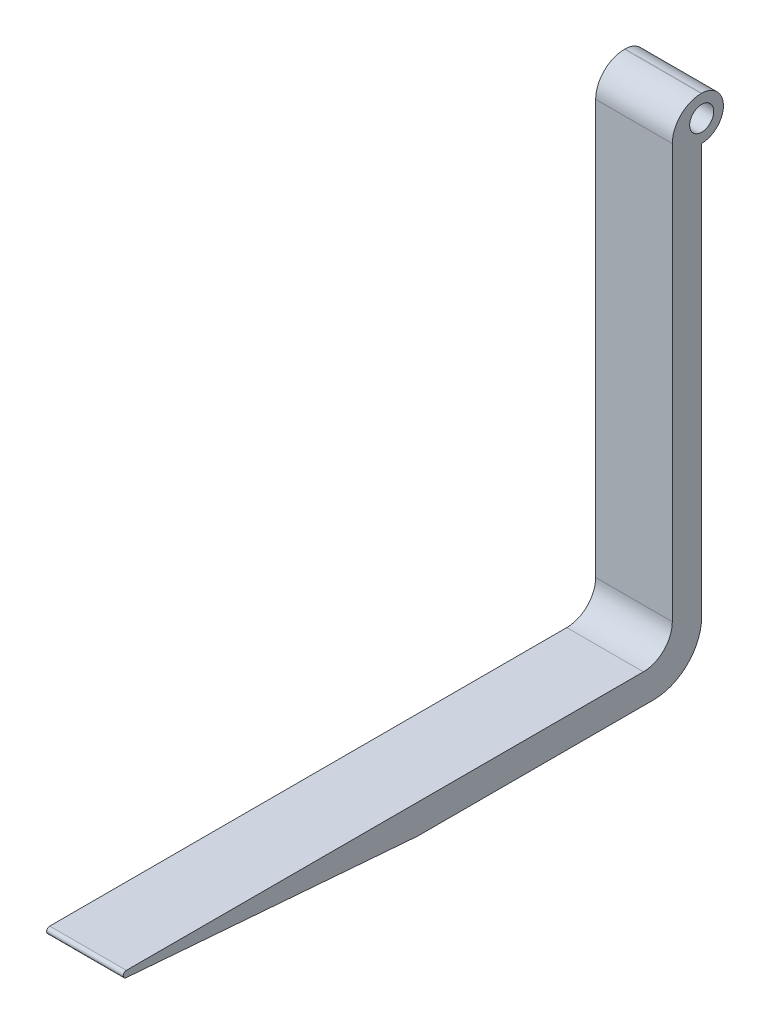
ISO-10303-21;
HEADER;
FILE_DESCRIPTION(('STEP AP214'),'2;1');
FILE_NAME('part.step','',(''),(''),'','','');
FILE_SCHEMA(('AUTOMOTIVE_DESIGN { 1 0 10303 214 1 1 1 1 }'));
ENDSEC;
DATA;
#1=APPLICATION_CONTEXT('core data for automotive mechanical design processes');
#2=APPLICATION_PROTOCOL_DEFINITION('international standard','automotive_design',2000,#1);
#3=PRODUCT_CONTEXT('',#1,'mechanical');
#4=PRODUCT('Part','Part','',(#3));
#5=PRODUCT_RELATED_PRODUCT_CATEGORY('part','',(#4));
#6=PRODUCT_DEFINITION_FORMATION('','',#4);
#7=PRODUCT_DEFINITION_CONTEXT('part definition',#1,'design');
#8=PRODUCT_DEFINITION('design','',#6,#7);
#9=PRODUCT_DEFINITION_SHAPE('','',#8);
#10=(LENGTH_UNIT() NAMED_UNIT(*) SI_UNIT(.MILLI.,.METRE.));
#11=(NAMED_UNIT(*) PLANE_ANGLE_UNIT() SI_UNIT($,.RADIAN.));
#12=(NAMED_UNIT(*) SI_UNIT($,.STERADIAN.) SOLID_ANGLE_UNIT());
#13=UNCERTAINTY_MEASURE_WITH_UNIT(LENGTH_MEASURE(1.E-05),#10,'distance_accuracy_value','');
#14=(GEOMETRIC_REPRESENTATION_CONTEXT(3) GLOBAL_UNCERTAINTY_ASSIGNED_CONTEXT((#13)) GLOBAL_UNIT_ASSIGNED_CONTEXT((#10,
#11,#12)) REPRESENTATION_CONTEXT('',''));
#15=CARTESIAN_POINT('',(0.,0.,0.));
#16=DIRECTION('',(0.,0.,1.));
#17=DIRECTION('',(1.,0.,0.));
#18=AXIS2_PLACEMENT_3D('',#15,#16,#17);
#19=CARTESIAN_POINT('',(0.,-465.4980716828,616.0019283172));
#20=DIRECTION('',(-1.,0.,0.));
#21=DIRECTION('',(0.,0.,1.));
#22=AXIS2_PLACEMENT_3D('',#19,#20,#21);
#23=CYLINDRICAL_SURFACE('',#22,6.49807168279988);
#24=DIRECTION('',(-1.,0.,0.));
#25=VECTOR('',#24,1.);
#26=CARTESIAN_POINT('',(159.,-459.,616.0019283172));
#27=LINE('',#26,#25);
#28=CARTESIAN_POINT('',(0.,-459.,616.0019283172));
#29=VERTEX_POINT('',#28);
#30=CARTESIAN_POINT('',(159.,-459.,616.0019283172));
#31=VERTEX_POINT('',#30);
#32=EDGE_CURVE('E208',#29,#31,#27,.F.);
#33=ORIENTED_EDGE('',*,*,#32,.F.);
#34=CARTESIAN_POINT('',(0.,-465.4980716828,616.0019283172));
#35=DIRECTION('',(1.,0.,0.));
#36=DIRECTION('',(0.,0.,-1.));
#37=AXIS2_PLACEMENT_3D('',#34,#35,#36);
#38=CIRCLE('',#37,6.49807168279988);
#39=CARTESIAN_POINT('',(0.,-471.975701280608,616.516952965551));
#40=VERTEX_POINT('',#39);
#41=EDGE_CURVE('E46',#40,#29,#38,.F.);
#42=ORIENTED_EDGE('',*,*,#41,.F.);
#43=DIRECTION('',(1.,0.,0.));
#44=VECTOR('',#43,1.);
#45=CARTESIAN_POINT('',(0.,-471.975701280608,616.51695296555));
#46=LINE('',#45,#44);
#47=CARTESIAN_POINT('',(159.,-471.975701280608,616.516952965551));
#48=VERTEX_POINT('',#47);
#49=EDGE_CURVE('E211',#48,#40,#46,.F.);
#50=ORIENTED_EDGE('',*,*,#49,.F.);
#51=CARTESIAN_POINT('',(159.,-465.4980716828,616.0019283172));
#52=DIRECTION('',(1.,0.,0.));
#53=DIRECTION('',(0.,0.,-1.));
#54=AXIS2_PLACEMENT_3D('',#51,#52,#53);
#55=CIRCLE('',#54,6.49807168279988);
#56=EDGE_CURVE('E12',#31,#48,#55,.T.);
#57=ORIENTED_EDGE('',*,*,#56,.F.);
#58=EDGE_LOOP('',(#33,#42,#50,#57));
#59=FACE_BOUND('',#58,.T.);
#60=ADVANCED_FACE('F38',(#59),#23,.T.);
#61=CARTESIAN_POINT('',(159.,-420.,-477.5));
#62=DIRECTION('',(1.,0.,0.));
#63=DIRECTION('',(0.,0.,-1.));
#64=AXIS2_PLACEMENT_3D('',#61,#62,#63);
#65=CYLINDRICAL_SURFACE('',#64,100.);
#66=DIRECTION('',(1.,0.,0.));
#67=VECTOR('',#66,1.);
#68=CARTESIAN_POINT('',(159.,-520.,-477.5));
#69=LINE('',#68,#67);
#70=CARTESIAN_POINT('',(0.,-520.,-477.5));
#71=VERTEX_POINT('',#70);
#72=CARTESIAN_POINT('',(159.,-520.,-477.5));
#73=VERTEX_POINT('',#72);
#74=EDGE_CURVE('E200',#71,#73,#69,.T.);
#75=ORIENTED_EDGE('',*,*,#74,.F.);
#76=CARTESIAN_POINT('',(0.,-420.,-477.5));
#77=DIRECTION('',(1.,0.,0.));
#78=DIRECTION('',(0.,0.,-1.));
#79=AXIS2_PLACEMENT_3D('',#76,#77,#78);
#80=CIRCLE('',#79,100.);
#81=CARTESIAN_POINT('',(0.,-420.,-577.5));
#82=VERTEX_POINT('',#81);
#83=EDGE_CURVE('E205',#82,#71,#80,.F.);
#84=ORIENTED_EDGE('',*,*,#83,.F.);
#85=DIRECTION('',(1.,0.,0.));
#86=VECTOR('',#85,1.);
#87=CARTESIAN_POINT('',(159.,-420.,-577.5));
#88=LINE('',#87,#86);
#89=CARTESIAN_POINT('',(159.,-420.,-577.5));
#90=VERTEX_POINT('',#89);
#91=EDGE_CURVE('E203',#90,#82,#88,.F.);
#92=ORIENTED_EDGE('',*,*,#91,.F.);
#93=CARTESIAN_POINT('',(159.,-420.,-477.5));
#94=DIRECTION('',(1.,0.,0.));
#95=DIRECTION('',(0.,0.,-1.));
#96=AXIS2_PLACEMENT_3D('',#93,#94,#95);
#97=CIRCLE('',#96,100.);
#98=EDGE_CURVE('E142',#73,#90,#97,.T.);
#99=ORIENTED_EDGE('',*,*,#98,.F.);
#100=EDGE_LOOP('',(#75,#84,#92,#99));
#101=FACE_BOUND('',#100,.T.);
#102=ADVANCED_FACE('F245',(#101),#65,.T.);
#103=CARTESIAN_POINT('',(159.,460.,-576.5));
#104=DIRECTION('',(1.,0.,0.));
#105=DIRECTION('',(0.,0.,-1.));
#106=AXIS2_PLACEMENT_3D('',#103,#104,#105);
#107=CYLINDRICAL_SURFACE('',#106,60.);
#108=DIRECTION('',(1.,0.,0.));
#109=VECTOR('',#108,1.);
#110=CARTESIAN_POINT('',(159.,520.,-576.5));
#111=LINE('',#110,#109);
#112=CARTESIAN_POINT('',(0.,520.,-576.5));
#113=VERTEX_POINT('',#112);
#114=CARTESIAN_POINT('',(159.,520.,-576.5));
#115=VERTEX_POINT('',#114);
#116=EDGE_CURVE('E129',#113,#115,#111,.T.);
#117=ORIENTED_EDGE('',*,*,#116,.F.);
#118=CARTESIAN_POINT('',(0.,460.,-576.5));
#119=DIRECTION('',(1.,0.,0.));
#120=DIRECTION('',(0.,0.,-1.));
#121=AXIS2_PLACEMENT_3D('',#118,#119,#120);
#122=CIRCLE('',#121,60.);
#123=CARTESIAN_POINT('',(0.,460.,-516.5));
#124=VERTEX_POINT('',#123);
#125=EDGE_CURVE('E185',#124,#113,#122,.F.);
#126=ORIENTED_EDGE('',*,*,#125,.F.);
#127=DIRECTION('',(1.,0.,0.));
#128=VECTOR('',#127,1.);
#129=CARTESIAN_POINT('',(159.,460.,-516.5));
#130=LINE('',#129,#128);
#131=CARTESIAN_POINT('',(159.,460.,-516.5));
#132=VERTEX_POINT('',#131);
#133=EDGE_CURVE('E182',#132,#124,#130,.F.);
#134=ORIENTED_EDGE('',*,*,#133,.F.);
#135=CARTESIAN_POINT('',(159.,460.,-576.5));
#136=DIRECTION('',(1.,0.,0.));
#137=DIRECTION('',(0.,0.,-1.));
#138=AXIS2_PLACEMENT_3D('',#135,#136,#137);
#139=CIRCLE('',#138,60.);
#140=EDGE_CURVE('E187',#115,#132,#139,.T.);
#141=ORIENTED_EDGE('',*,*,#140,.F.);
#142=EDGE_LOOP('',(#117,#126,#134,#141));
#143=FACE_BOUND('',#142,.T.);
#144=ADVANCED_FACE('F232',(#143),#107,.T.);
#145=CARTESIAN_POINT('',(159.,0.,-577.5));
#146=DIRECTION('',(0.,0.,-1.));
#147=DIRECTION('',(0.,1.,0.));
#148=AXIS2_PLACEMENT_3D('',#145,#146,#147);
#149=PLANE('',#148);
#150=DIRECTION('',(0.,-1.,0.));
#151=VECTOR('',#150,1.);
#152=CARTESIAN_POINT('',(159.,0.,-577.5));
#153=LINE('',#152,#151);
#154=CARTESIAN_POINT('',(159.,430.,-577.5));
#155=VERTEX_POINT('',#154);
#156=EDGE_CURVE('E123',#155,#90,#153,.T.);
#157=ORIENTED_EDGE('',*,*,#156,.T.);
#158=ORIENTED_EDGE('',*,*,#91,.T.);
#159=DIRECTION('',(0.,-1.,0.));
#160=VECTOR('',#159,1.);
#161=CARTESIAN_POINT('',(0.,0.,-577.5));
#162=LINE('',#161,#160);
#163=CARTESIAN_POINT('',(0.,430.,-577.5));
#164=VERTEX_POINT('',#163);
#165=EDGE_CURVE('E125',#164,#82,#162,.T.);
#166=ORIENTED_EDGE('',*,*,#165,.F.);
#167=DIRECTION('',(-1.,0.,0.));
#168=VECTOR('',#167,1.);
#169=CARTESIAN_POINT('',(159.,430.,-577.5));
#170=LINE('',#169,#168);
#171=EDGE_CURVE('E118',#155,#164,#170,.T.);
#172=ORIENTED_EDGE('',*,*,#171,.F.);
#173=EDGE_LOOP('',(#157,#158,#166,#172));
#174=FACE_BOUND('',#173,.T.);
#175=ADVANCED_FACE('F120',(#174),#149,.T.);
#176=CARTESIAN_POINT('',(159.,475.,-577.5));
#177=DIRECTION('',(-1.,0.,0.));
#178=DIRECTION('',(0.,0.,1.));
#179=AXIS2_PLACEMENT_3D('',#176,#177,#178);
#180=CYLINDRICAL_SURFACE('',#179,45.);
#181=CARTESIAN_POINT('',(0.,475.,-577.5));
#182=DIRECTION('',(1.,0.,0.));
#183=DIRECTION('',(0.,0.,-1.));
#184=AXIS2_PLACEMENT_3D('',#181,#182,#183);
#185=CIRCLE('',#184,45.);
#186=CARTESIAN_POINT('',(0.,520.,-577.5));
#187=VERTEX_POINT('',#186);
#188=EDGE_CURVE('E165',#164,#187,#185,.T.);
#189=ORIENTED_EDGE('',*,*,#188,.T.);
#190=DIRECTION('',(-1.,0.,0.));
#191=VECTOR('',#190,1.);
#192=CARTESIAN_POINT('',(159.,520.,-577.5));
#193=LINE('',#192,#191);
#194=CARTESIAN_POINT('',(159.,520.,-577.5));
#195=VERTEX_POINT('',#194);
#196=EDGE_CURVE('E130',#195,#187,#193,.T.);
#197=ORIENTED_EDGE('',*,*,#196,.F.);
#198=CARTESIAN_POINT('',(159.,475.,-577.5));
#199=DIRECTION('',(1.,0.,0.));
#200=DIRECTION('',(0.,0.,-1.));
#201=AXIS2_PLACEMENT_3D('',#198,#199,#200);
#202=CIRCLE('',#201,45.);
#203=EDGE_CURVE('E134',#155,#195,#202,.T.);
#204=ORIENTED_EDGE('',*,*,#203,.F.);
#205=ORIENTED_EDGE('',*,*,#171,.T.);
#206=EDGE_LOOP('',(#189,#197,#204,#205));
#207=FACE_BOUND('',#206,.T.);
#208=ADVANCED_FACE('F135',(#207),#180,.T.);
#209=CARTESIAN_POINT('',(159.,520.,0.));
#210=DIRECTION('',(0.,1.,0.));
#211=DIRECTION('',(0.,0.,1.));
#212=AXIS2_PLACEMENT_3D('',#209,#210,#211);
#213=PLANE('',#212);
#214=DIRECTION('',(0.,0.,-1.));
#215=VECTOR('',#214,1.);
#216=CARTESIAN_POINT('',(0.,520.,0.));
#217=LINE('',#216,#215);
#218=EDGE_CURVE('E167',#113,#187,#217,.T.);
#219=ORIENTED_EDGE('',*,*,#218,.F.);
#220=ORIENTED_EDGE('',*,*,#116,.T.);
#221=DIRECTION('',(0.,0.,-1.));
#222=VECTOR('',#221,1.);
#223=CARTESIAN_POINT('',(159.,520.,0.));
#224=LINE('',#223,#222);
#225=EDGE_CURVE('E138',#115,#195,#224,.T.);
#226=ORIENTED_EDGE('',*,*,#225,.T.);
#227=ORIENTED_EDGE('',*,*,#196,.T.);
#228=EDGE_LOOP('',(#219,#220,#226,#227));
#229=FACE_BOUND('',#228,.T.);
#230=ADVANCED_FACE('F235',(#229),#213,.T.);
#231=CARTESIAN_POINT('',(159.,0.,-516.5));
#232=DIRECTION('',(0.,0.,1.));
#233=DIRECTION('',(1.,0.,0.));
#234=AXIS2_PLACEMENT_3D('',#231,#232,#233);
#235=PLANE('',#234);
#236=DIRECTION('',(0.,1.,0.));
#237=VECTOR('',#236,1.);
#238=CARTESIAN_POINT('',(0.,0.,-516.5));
#239=LINE('',#238,#237);
#240=CARTESIAN_POINT('',(0.,-399.,-516.5));
#241=VERTEX_POINT('',#240);
#242=EDGE_CURVE('E169',#241,#124,#239,.T.);
#243=ORIENTED_EDGE('',*,*,#242,.F.);
#244=DIRECTION('',(-1.,0.,0.));
#245=VECTOR('',#244,1.);
#246=CARTESIAN_POINT('',(159.,-399.,-516.5));
#247=LINE('',#246,#245);
#248=CARTESIAN_POINT('',(159.,-399.,-516.5));
#249=VERTEX_POINT('',#248);
#250=EDGE_CURVE('E193',#241,#249,#247,.F.);
#251=ORIENTED_EDGE('',*,*,#250,.T.);
#252=DIRECTION('',(0.,1.,0.));
#253=VECTOR('',#252,1.);
#254=CARTESIAN_POINT('',(159.,0.,-516.5));
#255=LINE('',#254,#253);
#256=EDGE_CURVE('E151',#249,#132,#255,.T.);
#257=ORIENTED_EDGE('',*,*,#256,.T.);
#258=ORIENTED_EDGE('',*,*,#133,.T.);
#259=EDGE_LOOP('',(#243,#251,#257,#258));
#260=FACE_BOUND('',#259,.T.);
#261=ADVANCED_FACE('F227',(#260),#235,.T.);
#262=CARTESIAN_POINT('',(159.,-459.,0.));
#263=DIRECTION('',(0.,1.,0.));
#264=DIRECTION('',(0.,0.,1.));
#265=AXIS2_PLACEMENT_3D('',#262,#263,#264);
#266=PLANE('',#265);
#267=DIRECTION('',(0.,0.,-1.));
#268=VECTOR('',#267,1.);
#269=CARTESIAN_POINT('',(0.,-459.,0.));
#270=LINE('',#269,#268);
#271=CARTESIAN_POINT('',(0.,-459.,-456.5));
#272=VERTEX_POINT('',#271);
#273=EDGE_CURVE('E171',#29,#272,#270,.T.);
#274=ORIENTED_EDGE('',*,*,#273,.F.);
#275=ORIENTED_EDGE('',*,*,#32,.T.);
#276=DIRECTION('',(0.,0.,-1.));
#277=VECTOR('',#276,1.);
#278=CARTESIAN_POINT('',(159.,-459.,0.));
#279=LINE('',#278,#277);
#280=CARTESIAN_POINT('',(159.,-459.,-456.5));
#281=VERTEX_POINT('',#280);
#282=EDGE_CURVE('E153',#31,#281,#279,.T.);
#283=ORIENTED_EDGE('',*,*,#282,.T.);
#284=DIRECTION('',(-1.,0.,0.));
#285=VECTOR('',#284,1.);
#286=CARTESIAN_POINT('',(0.,-459.,-456.5));
#287=LINE('',#286,#285);
#288=EDGE_CURVE('E190',#281,#272,#287,.T.);
#289=ORIENTED_EDGE('',*,*,#288,.T.);
#290=EDGE_LOOP('',(#274,#275,#283,#289));
#291=FACE_BOUND('',#290,.T.);
#292=ADVANCED_FACE('F218',(#291),#266,.T.);
#293=CARTESIAN_POINT('',(159.,-517.721051215476,41.1630671868042));
#294=DIRECTION('',(0.,0.996854130580606,-0.0792580743166548));
#295=DIRECTION('',(0.,0.0792580743166548,0.996854130580606));
#296=AXIS2_PLACEMENT_3D('',#293,#294,#295);
#297=PLANE('',#296);
#298=DIRECTION('',(0.,-0.0792580743166548,-0.996854130580606));
#299=VECTOR('',#298,1.);
#300=CARTESIAN_POINT('',(159.,-517.721051215476,41.1630671868042));
#301=LINE('',#300,#299);
#302=CARTESIAN_POINT('',(159.,-520.,12.4999999999992));
#303=VERTEX_POINT('',#302);
#304=EDGE_CURVE('E155',#48,#303,#301,.T.);
#305=ORIENTED_EDGE('',*,*,#304,.F.);
#306=ORIENTED_EDGE('',*,*,#49,.T.);
#307=DIRECTION('',(0.,-0.0792580743166548,-0.996854130580606));
#308=VECTOR('',#307,1.);
#309=CARTESIAN_POINT('',(0.,-517.721051215476,41.1630671868042));
#310=LINE('',#309,#308);
#311=CARTESIAN_POINT('',(0.,-520.,12.4999999999992));
#312=VERTEX_POINT('',#311);
#313=EDGE_CURVE('E173',#40,#312,#310,.T.);
#314=ORIENTED_EDGE('',*,*,#313,.T.);
#315=DIRECTION('',(-1.,0.,0.));
#316=VECTOR('',#315,1.);
#317=CARTESIAN_POINT('',(159.,-520.,12.4999999999992));
#318=LINE('',#317,#316);
#319=EDGE_CURVE('E160',#303,#312,#318,.T.);
#320=ORIENTED_EDGE('',*,*,#319,.F.);
#321=EDGE_LOOP('',(#305,#306,#314,#320));
#322=FACE_BOUND('',#321,.T.);
#323=ADVANCED_FACE('F262',(#322),#297,.F.);
#324=CARTESIAN_POINT('',(159.,475.,-577.5));
#325=DIRECTION('',(-1.,0.,0.));
#326=DIRECTION('',(0.,0.,1.));
#327=AXIS2_PLACEMENT_3D('',#324,#325,#326);
#328=CYLINDRICAL_SURFACE('',#327,25.);
#329=CARTESIAN_POINT('',(159.,475.,-577.5));
#330=DIRECTION('',(1.,0.,0.));
#331=DIRECTION('',(0.,0.,-1.));
#332=AXIS2_PLACEMENT_3D('',#329,#330,#331);
#333=CIRCLE('',#332,25.);
#334=CARTESIAN_POINT('',(159.,475.,-552.5));
#335=VERTEX_POINT('',#334);
#336=EDGE_CURVE('E144',#335,#335,#333,.T.);
#337=CARTESIAN_POINT('',(0.,475.,-577.5));
#338=DIRECTION('',(1.,0.,0.));
#339=DIRECTION('',(0.,0.,-1.));
#340=AXIS2_PLACEMENT_3D('',#337,#338,#339);
#341=CIRCLE('',#340,25.);
#342=CARTESIAN_POINT('',(0.,475.,-552.5));
#343=VERTEX_POINT('',#342);
#344=EDGE_CURVE('E161',#343,#343,#341,.T.);
#345=CARTESIAN_POINT('',(159.,475.,-552.5));
#346=CARTESIAN_POINT('',(157.34375,475.,-552.5));
#347=CARTESIAN_POINT('',(155.6875,475.,-552.5));
#348=CARTESIAN_POINT('',(152.375,475.,-552.5));
#349=CARTESIAN_POINT('',(150.71875,475.,-552.5));
#350=CARTESIAN_POINT('',(147.40625,475.,-552.5));
#351=CARTESIAN_POINT('',(145.75,475.,-552.5));
#352=CARTESIAN_POINT('',(142.4375,475.,-552.5));
#353=CARTESIAN_POINT('',(140.78125,475.,-552.5));
#354=CARTESIAN_POINT('',(137.46875,475.,-552.5));
#355=CARTESIAN_POINT('',(135.8125,475.,-552.5));
#356=CARTESIAN_POINT('',(132.5,475.,-552.5));
#357=CARTESIAN_POINT('',(130.84375,475.,-552.5));
#358=CARTESIAN_POINT('',(127.53125,475.,-552.5));
#359=CARTESIAN_POINT('',(125.875,475.,-552.5));
#360=CARTESIAN_POINT('',(122.5625,475.,-552.5));
#361=CARTESIAN_POINT('',(120.90625,475.,-552.5));
#362=CARTESIAN_POINT('',(117.59375,475.,-552.5));
#363=CARTESIAN_POINT('',(115.9375,475.,-552.5));
#364=CARTESIAN_POINT('',(112.625,475.,-552.5));
#365=CARTESIAN_POINT('',(110.96875,475.,-552.5));
#366=CARTESIAN_POINT('',(107.65625,475.,-552.5));
#367=CARTESIAN_POINT('',(106.,475.,-552.5));
#368=CARTESIAN_POINT('',(102.6875,475.,-552.5));
#369=CARTESIAN_POINT('',(101.03125,475.,-552.5));
#370=CARTESIAN_POINT('',(97.71875,475.,-552.5));
#371=CARTESIAN_POINT('',(96.0625,475.,-552.5));
#372=CARTESIAN_POINT('',(92.75,475.,-552.5));
#373=CARTESIAN_POINT('',(91.09375,475.,-552.5));
#374=CARTESIAN_POINT('',(87.78125,475.,-552.5));
#375=CARTESIAN_POINT('',(86.125,475.,-552.5));
#376=CARTESIAN_POINT('',(82.8125,475.,-552.5));
#377=CARTESIAN_POINT('',(81.15625,475.,-552.5));
#378=CARTESIAN_POINT('',(77.84375,475.,-552.5));
#379=CARTESIAN_POINT('',(76.1875,475.,-552.5));
#380=CARTESIAN_POINT('',(72.875,475.,-552.5));
#381=CARTESIAN_POINT('',(71.21875,475.,-552.5));
#382=CARTESIAN_POINT('',(67.90625,475.,-552.5));
#383=CARTESIAN_POINT('',(66.25,475.,-552.5));
#384=CARTESIAN_POINT('',(62.9375,475.,-552.5));
#385=CARTESIAN_POINT('',(61.28125,475.,-552.5));
#386=CARTESIAN_POINT('',(57.96875,475.,-552.5));
#387=CARTESIAN_POINT('',(56.3125,475.,-552.5));
#388=CARTESIAN_POINT('',(53.,475.,-552.5));
#389=CARTESIAN_POINT('',(51.34375,475.,-552.5));
#390=CARTESIAN_POINT('',(48.03125,475.,-552.5));
#391=CARTESIAN_POINT('',(46.375,475.,-552.5));
#392=CARTESIAN_POINT('',(43.0625,475.,-552.5));
#393=CARTESIAN_POINT('',(41.40625,475.,-552.5));
#394=CARTESIAN_POINT('',(38.09375,475.,-552.5));
#395=CARTESIAN_POINT('',(36.4375,475.,-552.5));
#396=CARTESIAN_POINT('',(33.125,475.,-552.5));
#397=CARTESIAN_POINT('',(31.46875,475.,-552.5));
#398=CARTESIAN_POINT('',(28.15625,475.,-552.5));
#399=CARTESIAN_POINT('',(26.5,475.,-552.5));
#400=CARTESIAN_POINT('',(23.1875,475.,-552.5));
#401=CARTESIAN_POINT('',(21.53125,475.,-552.5));
#402=CARTESIAN_POINT('',(18.21875,475.,-552.5));
#403=CARTESIAN_POINT('',(16.5625,475.,-552.5));
#404=CARTESIAN_POINT('',(13.25,475.,-552.5));
#405=CARTESIAN_POINT('',(11.59375,475.,-552.5));
#406=CARTESIAN_POINT('',(8.28124999999999,475.,-552.5));
#407=CARTESIAN_POINT('',(6.62499999999999,475.,-552.5));
#408=CARTESIAN_POINT('',(3.3125,475.,-552.5));
#409=CARTESIAN_POINT('',(1.65625,475.,-552.5));
#410=CARTESIAN_POINT('',(0.,475.,-552.5));
#411=B_SPLINE_CURVE_WITH_KNOTS('',3,(#345,#346,#347,#348,#349,#350,#351,#352,#353,#354,#355,
#356,#357,#358,#359,#360,#361,#362,#363,#364,#365,#366,#367,#368,#369,#370,#371,#372,#373,#374,
#375,#376,#377,#378,#379,#380,#381,#382,#383,#384,#385,#386,#387,#388,#389,#390,#391,#392,#393,
#394,#395,#396,#397,#398,#399,#400,#401,#402,#403,#404,#405,#406,#407,#408,#409,#410),
.UNSPECIFIED.,.F.,.F.,(4,2,2,2,2,2,2,2,2,2,2,2,2,2,2,2,2,2,2,2,2,2,2,2,2,2,2,2,2,2,2,2,4),(0.,
4.96874999999999,9.93749999999999,14.90625,19.875,24.84375,29.8125,34.78125,39.75,44.71875,
49.6875,54.65625,59.625,64.59375,69.5625,74.53125,79.5,84.46875,89.4375,94.40625,99.375,
104.34375,109.3125,114.28125,119.25,124.21875,129.1875,134.15625,139.125,144.09375,149.0625,
154.03125,159.),.UNSPECIFIED.);
#412=EDGE_CURVE('BSEAM258',#335,#343,#411,.T.);
#413=ORIENTED_EDGE('',*,*,#336,.T.);
#414=ORIENTED_EDGE('',*,*,#344,.F.);
#415=ORIENTED_EDGE('',*,*,#412,.T.);
#416=ORIENTED_EDGE('',*,*,#412,.F.);
#417=EDGE_LOOP('',(#413,#415,#414,#416));
#418=FACE_BOUND('',#417,.T.);
#419=ADVANCED_FACE('F258',(#418),#328,.F.);
#420=CARTESIAN_POINT('',(159.,-520.,0.));
#421=DIRECTION('',(0.,-1.,0.));
#422=DIRECTION('',(0.,0.,-1.));
#423=AXIS2_PLACEMENT_3D('',#420,#421,#422);
#424=PLANE('',#423);
#425=DIRECTION('',(0.,0.,1.));
#426=VECTOR('',#425,1.);
#427=CARTESIAN_POINT('',(0.,-520.,0.));
#428=LINE('',#427,#426);
#429=EDGE_CURVE('E147',#71,#312,#428,.T.);
#430=ORIENTED_EDGE('',*,*,#429,.F.);
#431=ORIENTED_EDGE('',*,*,#74,.T.);
#432=DIRECTION('',(0.,0.,1.));
#433=VECTOR('',#432,1.);
#434=CARTESIAN_POINT('',(159.,-520.,0.));
#435=LINE('',#434,#433);
#436=EDGE_CURVE('E157',#73,#303,#435,.T.);
#437=ORIENTED_EDGE('',*,*,#436,.T.);
#438=ORIENTED_EDGE('',*,*,#319,.T.);
#439=EDGE_LOOP('',(#430,#431,#437,#438));
#440=FACE_BOUND('',#439,.T.);
#441=ADVANCED_FACE('F261',(#440),#424,.T.);
#442=CARTESIAN_POINT('',(159.,0.,0.));
#443=DIRECTION('',(1.,0.,0.));
#444=DIRECTION('',(0.,0.,-1.));
#445=AXIS2_PLACEMENT_3D('',#442,#443,#444);
#446=PLANE('',#445);
#447=ORIENTED_EDGE('',*,*,#336,.F.);
#448=EDGE_LOOP('',(#447));
#449=FACE_BOUND('',#448,.T.);
#450=ORIENTED_EDGE('',*,*,#282,.F.);
#451=ORIENTED_EDGE('',*,*,#56,.T.);
#452=ORIENTED_EDGE('',*,*,#304,.T.);
#453=ORIENTED_EDGE('',*,*,#436,.F.);
#454=ORIENTED_EDGE('',*,*,#98,.T.);
#455=ORIENTED_EDGE('',*,*,#156,.F.);
#456=ORIENTED_EDGE('',*,*,#203,.T.);
#457=ORIENTED_EDGE('',*,*,#225,.F.);
#458=ORIENTED_EDGE('',*,*,#140,.T.);
#459=ORIENTED_EDGE('',*,*,#256,.F.);
#460=CARTESIAN_POINT('',(159.,-399.,-456.5));
#461=DIRECTION('',(1.,0.,0.));
#462=DIRECTION('',(0.,0.,-1.));
#463=AXIS2_PLACEMENT_3D('',#460,#461,#462);
#464=CIRCLE('',#463,60.);
#465=EDGE_CURVE('E197',#249,#281,#464,.F.);
#466=ORIENTED_EDGE('',*,*,#465,.T.);
#467=EDGE_LOOP('',(#450,#451,#452,#453,#454,#455,#456,#457,#458,#459,#466));
#468=FACE_BOUND('',#467,.T.);
#469=ADVANCED_FACE('F140',(#449,#468),#446,.T.);
#470=CARTESIAN_POINT('',(0.,0.,0.));
#471=DIRECTION('',(1.,0.,0.));
#472=DIRECTION('',(0.,0.,-1.));
#473=AXIS2_PLACEMENT_3D('',#470,#471,#472);
#474=PLANE('',#473);
#475=ORIENTED_EDGE('',*,*,#344,.T.);
#476=EDGE_LOOP('',(#475));
#477=FACE_BOUND('',#476,.T.);
#478=ORIENTED_EDGE('',*,*,#313,.F.);
#479=ORIENTED_EDGE('',*,*,#41,.T.);
#480=ORIENTED_EDGE('',*,*,#273,.T.);
#481=CARTESIAN_POINT('',(0.,-399.,-456.5));
#482=DIRECTION('',(1.,0.,0.));
#483=DIRECTION('',(0.,0.,-1.));
#484=AXIS2_PLACEMENT_3D('',#481,#482,#483);
#485=CIRCLE('',#484,60.);
#486=EDGE_CURVE('E195',#272,#241,#485,.T.);
#487=ORIENTED_EDGE('',*,*,#486,.T.);
#488=ORIENTED_EDGE('',*,*,#242,.T.);
#489=ORIENTED_EDGE('',*,*,#125,.T.);
#490=ORIENTED_EDGE('',*,*,#218,.T.);
#491=ORIENTED_EDGE('',*,*,#188,.F.);
#492=ORIENTED_EDGE('',*,*,#165,.T.);
#493=ORIENTED_EDGE('',*,*,#83,.T.);
#494=ORIENTED_EDGE('',*,*,#429,.T.);
#495=EDGE_LOOP('',(#478,#479,#480,#487,#488,#489,#490,#491,#492,#493,#494));
#496=FACE_BOUND('',#495,.T.);
#497=ADVANCED_FACE('F214',(#477,#496),#474,.F.);
#498=CARTESIAN_POINT('',(159.,-399.,-456.5));
#499=DIRECTION('',(1.,0.,0.));
#500=DIRECTION('',(0.,0.,-1.));
#501=AXIS2_PLACEMENT_3D('',#498,#499,#500);
#502=CYLINDRICAL_SURFACE('',#501,60.);
#503=ORIENTED_EDGE('',*,*,#465,.F.);
#504=ORIENTED_EDGE('',*,*,#250,.F.);
#505=ORIENTED_EDGE('',*,*,#486,.F.);
#506=ORIENTED_EDGE('',*,*,#288,.F.);
#507=EDGE_LOOP('',(#503,#504,#505,#506));
#508=FACE_BOUND('',#507,.T.);
#509=ADVANCED_FACE('F222',(#508),#502,.F.);
#510=CLOSED_SHELL('',(#60,#102,#144,#175,#208,#230,#261,#292,#323,#419,#441,#469,#497,#509));
#511=MANIFOLD_SOLID_BREP('B2',#510);
#512=ADVANCED_BREP_SHAPE_REPRESENTATION('',(#18,#511),#14);
#513=SHAPE_DEFINITION_REPRESENTATION(#9,#512);
ENDSEC;
END-ISO-10303-21;
